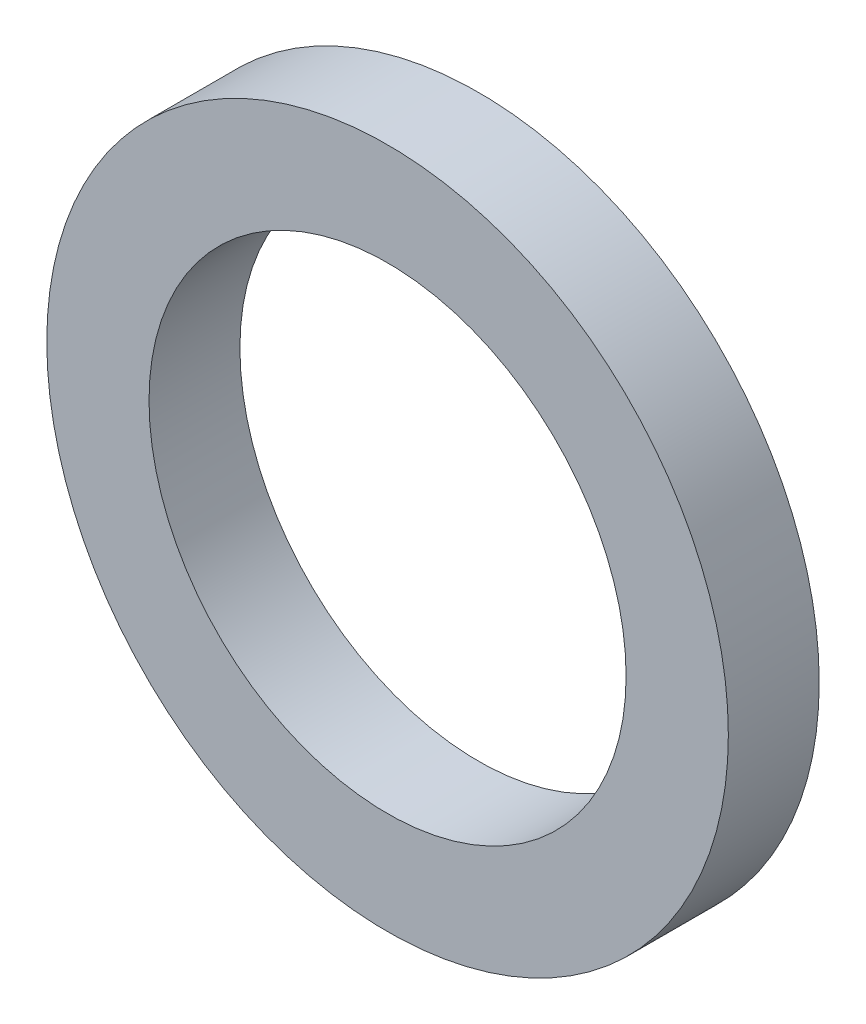
ISO-10303-21;
HEADER;
FILE_DESCRIPTION(('STEP AP214'),'2;1');
FILE_NAME('part.step','',(''),(''),'','','');
FILE_SCHEMA(('AUTOMOTIVE_DESIGN { 1 0 10303 214 1 1 1 1 }'));
ENDSEC;
DATA;
#1=APPLICATION_CONTEXT('core data for automotive mechanical design processes');
#2=APPLICATION_PROTOCOL_DEFINITION('international standard','automotive_design',2000,#1);
#3=PRODUCT_CONTEXT('',#1,'mechanical');
#4=PRODUCT('Part','Part','',(#3));
#5=PRODUCT_RELATED_PRODUCT_CATEGORY('part','',(#4));
#6=PRODUCT_DEFINITION_FORMATION('','',#4);
#7=PRODUCT_DEFINITION_CONTEXT('part definition',#1,'design');
#8=PRODUCT_DEFINITION('design','',#6,#7);
#9=PRODUCT_DEFINITION_SHAPE('','',#8);
#10=(LENGTH_UNIT() NAMED_UNIT(*) SI_UNIT(.MILLI.,.METRE.));
#11=(NAMED_UNIT(*) PLANE_ANGLE_UNIT() SI_UNIT($,.RADIAN.));
#12=(NAMED_UNIT(*) SI_UNIT($,.STERADIAN.) SOLID_ANGLE_UNIT());
#13=UNCERTAINTY_MEASURE_WITH_UNIT(LENGTH_MEASURE(1.E-05),#10,'distance_accuracy_value','');
#14=(GEOMETRIC_REPRESENTATION_CONTEXT(3) GLOBAL_UNCERTAINTY_ASSIGNED_CONTEXT((#13)) GLOBAL_UNIT_ASSIGNED_CONTEXT((#10,
#11,#12)) REPRESENTATION_CONTEXT('',''));
#15=CARTESIAN_POINT('',(0.,0.,0.));
#16=DIRECTION('',(0.,0.,1.));
#17=DIRECTION('',(1.,0.,0.));
#18=AXIS2_PLACEMENT_3D('',#15,#16,#17);
#19=CARTESIAN_POINT('',(0.,0.,4.));
#20=DIRECTION('',(0.,0.,1.));
#21=DIRECTION('',(1.,0.,0.));
#22=AXIS2_PLACEMENT_3D('',#19,#20,#21);
#23=PLANE('',#22);
#24=CARTESIAN_POINT('',(0.,0.,4.));
#25=DIRECTION('',(0.,0.,1.));
#26=DIRECTION('',(1.,0.,0.));
#27=AXIS2_PLACEMENT_3D('',#24,#25,#26);
#28=CIRCLE('',#27,30.);
#29=CARTESIAN_POINT('',(30.,0.,4.));
#30=VERTEX_POINT('',#29);
#31=EDGE_CURVE('E10',#30,#30,#28,.T.);
#32=ORIENTED_EDGE('',*,*,#31,.T.);
#33=EDGE_LOOP('',(#32));
#34=FACE_BOUND('',#33,.T.);
#35=CARTESIAN_POINT('',(0.,0.,4.));
#36=DIRECTION('',(0.,0.,1.));
#37=DIRECTION('',(1.,0.,0.));
#38=AXIS2_PLACEMENT_3D('',#35,#36,#37);
#39=CIRCLE('',#38,21.);
#40=CARTESIAN_POINT('',(21.,0.,4.));
#41=VERTEX_POINT('',#40);
#42=EDGE_CURVE('E56',#41,#41,#39,.T.);
#43=ORIENTED_EDGE('',*,*,#42,.F.);
#44=EDGE_LOOP('',(#43));
#45=FACE_BOUND('',#44,.T.);
#46=ADVANCED_FACE('F43',(#34,#45),#23,.T.);
#47=CARTESIAN_POINT('',(0.,0.,-4.));
#48=DIRECTION('',(0.,0.,1.));
#49=DIRECTION('',(1.,0.,0.));
#50=AXIS2_PLACEMENT_3D('',#47,#48,#49);
#51=PLANE('',#50);
#52=CARTESIAN_POINT('',(0.,0.,-4.));
#53=DIRECTION('',(0.,0.,1.));
#54=DIRECTION('',(1.,0.,0.));
#55=AXIS2_PLACEMENT_3D('',#52,#53,#54);
#56=CIRCLE('',#55,30.);
#57=CARTESIAN_POINT('',(30.,0.,-4.));
#58=VERTEX_POINT('',#57);
#59=EDGE_CURVE('E47',#58,#58,#56,.T.);
#60=ORIENTED_EDGE('',*,*,#59,.F.);
#61=EDGE_LOOP('',(#60));
#62=FACE_BOUND('',#61,.T.);
#63=CARTESIAN_POINT('',(0.,0.,-4.));
#64=DIRECTION('',(0.,0.,1.));
#65=DIRECTION('',(1.,0.,0.));
#66=AXIS2_PLACEMENT_3D('',#63,#64,#65);
#67=CIRCLE('',#66,21.);
#68=CARTESIAN_POINT('',(21.,0.,-4.));
#69=VERTEX_POINT('',#68);
#70=EDGE_CURVE('E58',#69,#69,#67,.T.);
#71=ORIENTED_EDGE('',*,*,#70,.T.);
#72=EDGE_LOOP('',(#71));
#73=FACE_BOUND('',#72,.T.);
#74=ADVANCED_FACE('F70',(#62,#73),#51,.F.);
#75=CARTESIAN_POINT('',(0.,0.,4.));
#76=DIRECTION('',(0.,0.,-1.));
#77=DIRECTION('',(-1.,0.,0.));
#78=AXIS2_PLACEMENT_3D('',#75,#76,#77);
#79=CYLINDRICAL_SURFACE('',#78,30.);
#80=ORIENTED_EDGE('',*,*,#31,.F.);
#81=EDGE_LOOP('',(#80));
#82=FACE_BOUND('',#81,.T.);
#83=ORIENTED_EDGE('',*,*,#59,.T.);
#84=EDGE_LOOP('',(#83));
#85=FACE_BOUND('',#84,.T.);
#86=ADVANCED_FACE('F45',(#82,#85),#79,.T.);
#87=CARTESIAN_POINT('',(0.,0.,4.));
#88=DIRECTION('',(0.,0.,-1.));
#89=DIRECTION('',(-1.,0.,0.));
#90=AXIS2_PLACEMENT_3D('',#87,#88,#89);
#91=CYLINDRICAL_SURFACE('',#90,21.);
#92=ORIENTED_EDGE('',*,*,#42,.T.);
#93=EDGE_LOOP('',(#92));
#94=FACE_BOUND('',#93,.T.);
#95=ORIENTED_EDGE('',*,*,#70,.F.);
#96=EDGE_LOOP('',(#95));
#97=FACE_BOUND('',#96,.T.);
#98=ADVANCED_FACE('F66',(#94,#97),#91,.F.);
#99=CLOSED_SHELL('',(#46,#74,#86,#98));
#100=MANIFOLD_SOLID_BREP('B2',#99);
#101=ADVANCED_BREP_SHAPE_REPRESENTATION('',(#18,#100),#14);
#102=SHAPE_DEFINITION_REPRESENTATION(#9,#101);
ENDSEC;
END-ISO-10303-21;
